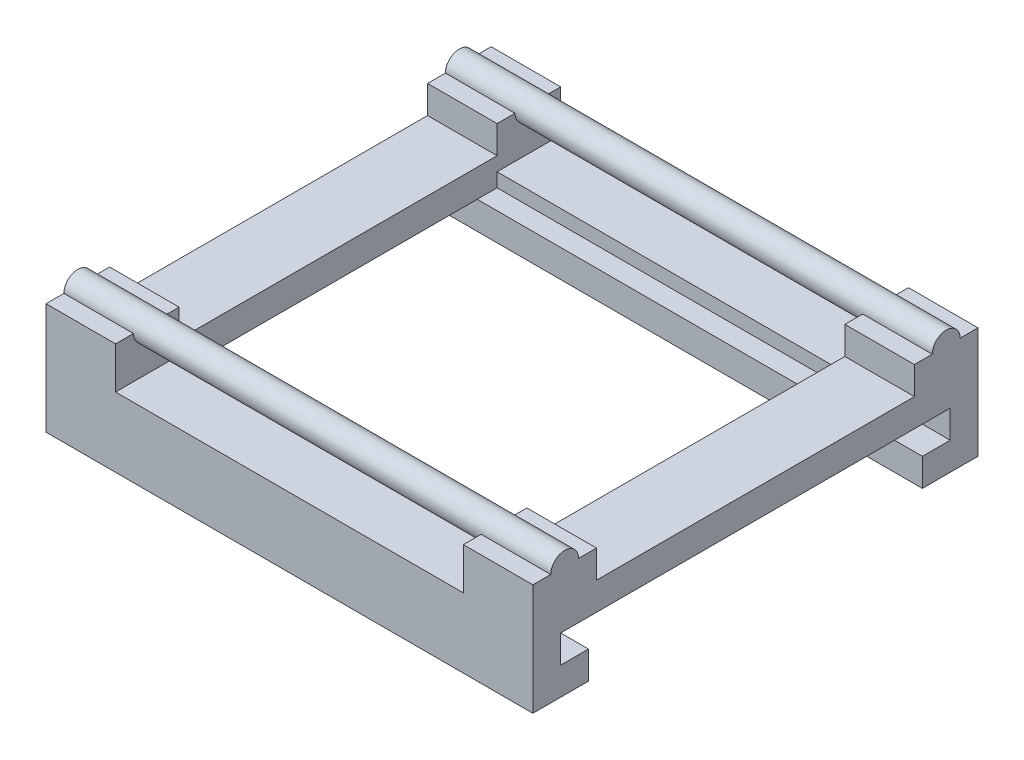
ISO-10303-21;
HEADER;
FILE_DESCRIPTION(('STEP AP214'),'2;1');
FILE_NAME('part.step','',(''),(''),'','','');
FILE_SCHEMA(('AUTOMOTIVE_DESIGN { 1 0 10303 214 1 1 1 1 }'));
ENDSEC;
DATA;
#1=APPLICATION_CONTEXT('core data for automotive mechanical design processes');
#2=APPLICATION_PROTOCOL_DEFINITION('international standard','automotive_design',2000,#1);
#3=PRODUCT_CONTEXT('',#1,'mechanical');
#4=PRODUCT('Part','Part','',(#3));
#5=PRODUCT_RELATED_PRODUCT_CATEGORY('part','',(#4));
#6=PRODUCT_DEFINITION_FORMATION('','',#4);
#7=PRODUCT_DEFINITION_CONTEXT('part definition',#1,'design');
#8=PRODUCT_DEFINITION('design','',#6,#7);
#9=PRODUCT_DEFINITION_SHAPE('','',#8);
#10=(LENGTH_UNIT() NAMED_UNIT(*) SI_UNIT(.MILLI.,.METRE.));
#11=(NAMED_UNIT(*) PLANE_ANGLE_UNIT() SI_UNIT($,.RADIAN.));
#12=(NAMED_UNIT(*) SI_UNIT($,.STERADIAN.) SOLID_ANGLE_UNIT());
#13=UNCERTAINTY_MEASURE_WITH_UNIT(LENGTH_MEASURE(1.E-05),#10,'distance_accuracy_value','');
#14=(GEOMETRIC_REPRESENTATION_CONTEXT(3) GLOBAL_UNCERTAINTY_ASSIGNED_CONTEXT((#13)) GLOBAL_UNIT_ASSIGNED_CONTEXT((#10,
#11,#12)) REPRESENTATION_CONTEXT('',''));
#15=CARTESIAN_POINT('',(0.,0.,0.));
#16=DIRECTION('',(0.,0.,1.));
#17=DIRECTION('',(1.,0.,0.));
#18=AXIS2_PLACEMENT_3D('',#15,#16,#17);
#19=CARTESIAN_POINT('',(0.,4.,0.));
#20=DIRECTION('',(0.,-1.,0.));
#21=DIRECTION('',(0.,0.,-1.));
#22=AXIS2_PLACEMENT_3D('',#19,#20,#21);
#23=PLANE('',#22);
#24=DIRECTION('',(0.,0.,-1.));
#25=VECTOR('',#24,1.);
#26=CARTESIAN_POINT('',(9.83009708737865,4.,11.6334951456311));
#27=LINE('',#26,#25);
#28=CARTESIAN_POINT('',(9.83009708737865,4.,11.6334951456311));
#29=VERTEX_POINT('',#28);
#30=CARTESIAN_POINT('',(9.83009708737865,4.,10.3477808599168));
#31=VERTEX_POINT('',#30);
#32=EDGE_CURVE('E350',#29,#31,#27,.T.);
#33=ORIENTED_EDGE('',*,*,#32,.T.);
#34=DIRECTION('',(-1.,0.,0.));
#35=VECTOR('',#34,1.);
#36=CARTESIAN_POINT('',(7.83009708737865,4.,10.3477808599168));
#37=LINE('',#36,#35);
#38=CARTESIAN_POINT('',(4.83009708737865,4.,10.3477808599168));
#39=VERTEX_POINT('',#38);
#40=EDGE_CURVE('E12',#39,#31,#37,.F.);
#41=ORIENTED_EDGE('',*,*,#40,.F.);
#42=DIRECTION('',(0.,0.,-1.));
#43=VECTOR('',#42,1.);
#44=CARTESIAN_POINT('',(4.83009708737865,4.,11.6334951456311));
#45=LINE('',#44,#43);
#46=CARTESIAN_POINT('',(4.83009708737865,4.,11.6334951456311));
#47=VERTEX_POINT('',#46);
#48=EDGE_CURVE('E356',#47,#39,#45,.T.);
#49=ORIENTED_EDGE('',*,*,#48,.F.);
#50=DIRECTION('',(-1.,0.,0.));
#51=VECTOR('',#50,1.);
#52=CARTESIAN_POINT('',(9.83009708737865,4.,11.6334951456311));
#53=LINE('',#52,#51);
#54=EDGE_CURVE('E352',#29,#47,#53,.T.);
#55=ORIENTED_EDGE('',*,*,#54,.F.);
#56=EDGE_LOOP('',(#33,#41,#49,#55));
#57=FACE_BOUND('',#56,.T.);
#58=ADVANCED_FACE('F63',(#57),#23,.F.);
#59=DIRECTION('',(-1.,0.,0.));
#60=VECTOR('',#59,1.);
#61=CARTESIAN_POINT('',(7.83009708737865,4.,8.34778085991679));
#62=LINE('',#61,#60);
#63=CARTESIAN_POINT('',(9.83009708737865,4.,8.34778085991679));
#64=VERTEX_POINT('',#63);
#65=CARTESIAN_POINT('',(4.83009708737865,4.,8.34778085991679));
#66=VERTEX_POINT('',#65);
#67=EDGE_CURVE('E71',#64,#66,#62,.T.);
#68=ORIENTED_EDGE('',*,*,#67,.F.);
#69=CARTESIAN_POINT('',(9.83009708737865,4.,7.0620665742025));
#70=VERTEX_POINT('',#69);
#71=EDGE_CURVE('E344',#64,#70,#27,.T.);
#72=ORIENTED_EDGE('',*,*,#71,.T.);
#73=DIRECTION('',(-1.,0.,0.));
#74=VECTOR('',#73,1.);
#75=CARTESIAN_POINT('',(9.83009708737865,4.,7.0620665742025));
#76=LINE('',#75,#74);
#77=CARTESIAN_POINT('',(4.83009708737865,4.,7.0620665742025));
#78=VERTEX_POINT('',#77);
#79=EDGE_CURVE('E349',#70,#78,#76,.T.);
#80=ORIENTED_EDGE('',*,*,#79,.T.);
#81=EDGE_CURVE('E355',#66,#78,#45,.T.);
#82=ORIENTED_EDGE('',*,*,#81,.F.);
#83=EDGE_LOOP('',(#68,#72,#80,#82));
#84=FACE_BOUND('',#83,.T.);
#85=ADVANCED_FACE('F508',(#84),#23,.F.);
#86=CARTESIAN_POINT('',(0.,4.,0.));
#87=DIRECTION('',(0.,1.,0.));
#88=DIRECTION('',(0.,0.,1.));
#89=AXIS2_PLACEMENT_3D('',#86,#87,#88);
#90=PLANE('',#89);
#91=DIRECTION('',(0.,0.,-1.));
#92=VECTOR('',#91,1.);
#93=CARTESIAN_POINT('',(-25.1699029126214,4.,11.6334951456311));
#94=LINE('',#93,#92);
#95=CARTESIAN_POINT('',(-25.1699029126214,4.,8.34778085991679));
#96=VERTEX_POINT('',#95);
#97=CARTESIAN_POINT('',(-25.1699029126214,4.,7.0620665742025));
#98=VERTEX_POINT('',#97);
#99=EDGE_CURVE('E310',#96,#98,#94,.T.);
#100=ORIENTED_EDGE('',*,*,#99,.F.);
#101=DIRECTION('',(-1.,0.,0.));
#102=VECTOR('',#101,1.);
#103=CARTESIAN_POINT('',(9.83009708737865,4.,8.34778085991679));
#104=LINE('',#103,#102);
#105=CARTESIAN_POINT('',(-20.1699029126214,4.,8.34778085991679));
#106=VERTEX_POINT('',#105);
#107=EDGE_CURVE('E293',#96,#106,#104,.F.);
#108=ORIENTED_EDGE('',*,*,#107,.T.);
#109=DIRECTION('',(0.,0.,-1.));
#110=VECTOR('',#109,1.);
#111=CARTESIAN_POINT('',(-20.1699029126214,4.,11.6334951456311));
#112=LINE('',#111,#110);
#113=CARTESIAN_POINT('',(-20.1699029126214,4.,7.0620665742025));
#114=VERTEX_POINT('',#113);
#115=EDGE_CURVE('E331',#106,#114,#112,.T.);
#116=ORIENTED_EDGE('',*,*,#115,.T.);
#117=DIRECTION('',(1.,0.,0.));
#118=VECTOR('',#117,1.);
#119=CARTESIAN_POINT('',(-25.1699029126214,4.,7.0620665742025));
#120=LINE('',#119,#118);
#121=EDGE_CURVE('E319',#98,#114,#120,.T.);
#122=ORIENTED_EDGE('',*,*,#121,.F.);
#123=EDGE_LOOP('',(#100,#108,#116,#122));
#124=FACE_BOUND('',#123,.T.);
#125=ADVANCED_FACE('F317',(#124),#90,.T.);
#126=CARTESIAN_POINT('',(-20.1699029126214,4.,11.6334951456311));
#127=VERTEX_POINT('',#126);
#128=CARTESIAN_POINT('',(-20.1699029126214,4.,10.3477808599168));
#129=VERTEX_POINT('',#128);
#130=EDGE_CURVE('E332',#127,#129,#112,.T.);
#131=ORIENTED_EDGE('',*,*,#130,.T.);
#132=DIRECTION('',(-1.,0.,0.));
#133=VECTOR('',#132,1.);
#134=CARTESIAN_POINT('',(9.83009708737865,4.,10.3477808599168));
#135=LINE('',#134,#133);
#136=CARTESIAN_POINT('',(-25.1699029126214,4.,10.3477808599168));
#137=VERTEX_POINT('',#136);
#138=EDGE_CURVE('E304',#129,#137,#135,.T.);
#139=ORIENTED_EDGE('',*,*,#138,.T.);
#140=CARTESIAN_POINT('',(-25.1699029126214,4.,11.6334951456311));
#141=VERTEX_POINT('',#140);
#142=EDGE_CURVE('E313',#141,#137,#94,.T.);
#143=ORIENTED_EDGE('',*,*,#142,.F.);
#144=DIRECTION('',(1.,0.,0.));
#145=VECTOR('',#144,1.);
#146=CARTESIAN_POINT('',(-25.1699029126214,4.,11.6334951456311));
#147=LINE('',#146,#145);
#148=EDGE_CURVE('E322',#141,#127,#147,.T.);
#149=ORIENTED_EDGE('',*,*,#148,.T.);
#150=EDGE_LOOP('',(#131,#139,#143,#149));
#151=FACE_BOUND('',#150,.T.);
#152=ADVANCED_FACE('F716',(#151),#90,.T.);
#153=CARTESIAN_POINT('',(0.,4.,0.));
#154=DIRECTION('',(0.,1.,0.));
#155=DIRECTION('',(0.,0.,1.));
#156=AXIS2_PLACEMENT_3D('',#153,#154,#155);
#157=PLANE('',#156);
#158=DIRECTION('',(-1.,0.,0.));
#159=VECTOR('',#158,1.);
#160=CARTESIAN_POINT('',(7.83009708737865,4.,-19.0807905686546));
#161=LINE('',#160,#159);
#162=CARTESIAN_POINT('',(4.83009708737864,4.,-19.0807905686546));
#163=VERTEX_POINT('',#162);
#164=CARTESIAN_POINT('',(9.83009708737865,4.,-19.0807905686546));
#165=VERTEX_POINT('',#164);
#166=EDGE_CURVE('E499',#163,#165,#161,.F.);
#167=ORIENTED_EDGE('',*,*,#166,.T.);
#168=DIRECTION('',(0.,0.,-1.));
#169=VECTOR('',#168,1.);
#170=CARTESIAN_POINT('',(9.83009708737865,4.,0.));
#171=LINE('',#170,#169);
#172=CARTESIAN_POINT('',(9.83009708737865,4.,-20.3665048543689));
#173=VERTEX_POINT('',#172);
#174=EDGE_CURVE('E371',#165,#173,#171,.T.);
#175=ORIENTED_EDGE('',*,*,#174,.T.);
#176=DIRECTION('',(-1.,0.,0.));
#177=VECTOR('',#176,1.);
#178=CARTESIAN_POINT('',(0.,4.,-20.3665048543689));
#179=LINE('',#178,#177);
#180=CARTESIAN_POINT('',(4.83009708737864,4.,-20.3665048543689));
#181=VERTEX_POINT('',#180);
#182=EDGE_CURVE('E361',#173,#181,#179,.T.);
#183=ORIENTED_EDGE('',*,*,#182,.T.);
#184=DIRECTION('',(0.,0.,1.));
#185=VECTOR('',#184,1.);
#186=CARTESIAN_POINT('',(4.83009708737864,4.,0.));
#187=LINE('',#186,#185);
#188=EDGE_CURVE('E365',#181,#163,#187,.T.);
#189=ORIENTED_EDGE('',*,*,#188,.T.);
#190=EDGE_LOOP('',(#167,#175,#183,#189));
#191=FACE_BOUND('',#190,.T.);
#192=ADVANCED_FACE('F626',(#191),#157,.T.);
#193=CARTESIAN_POINT('',(9.83009708737865,4.,-15.7950762829404));
#194=VERTEX_POINT('',#193);
#195=CARTESIAN_POINT('',(9.83009708737865,4.,-17.0807905686546));
#196=VERTEX_POINT('',#195);
#197=EDGE_CURVE('E372',#194,#196,#171,.T.);
#198=ORIENTED_EDGE('',*,*,#197,.T.);
#199=DIRECTION('',(-1.,0.,0.));
#200=VECTOR('',#199,1.);
#201=CARTESIAN_POINT('',(7.83009708737865,4.,-17.0807905686546));
#202=LINE('',#201,#200);
#203=CARTESIAN_POINT('',(4.83009708737864,4.,-17.0807905686546));
#204=VERTEX_POINT('',#203);
#205=EDGE_CURVE('E490',#196,#204,#202,.T.);
#206=ORIENTED_EDGE('',*,*,#205,.T.);
#207=CARTESIAN_POINT('',(4.83009708737864,4.,-15.7950762829404));
#208=VERTEX_POINT('',#207);
#209=EDGE_CURVE('E364',#204,#208,#187,.T.);
#210=ORIENTED_EDGE('',*,*,#209,.T.);
#211=DIRECTION('',(-1.,0.,0.));
#212=VECTOR('',#211,1.);
#213=CARTESIAN_POINT('',(0.,4.,-15.7950762829404));
#214=LINE('',#213,#212);
#215=EDGE_CURVE('E368',#194,#208,#214,.T.);
#216=ORIENTED_EDGE('',*,*,#215,.F.);
#217=EDGE_LOOP('',(#198,#206,#210,#216));
#218=FACE_BOUND('',#217,.T.);
#219=ADVANCED_FACE('F524',(#218),#157,.T.);
#220=CARTESIAN_POINT('',(0.,4.,0.));
#221=DIRECTION('',(0.,-1.,0.));
#222=DIRECTION('',(0.,0.,-1.));
#223=AXIS2_PLACEMENT_3D('',#220,#221,#222);
#224=PLANE('',#223);
#225=DIRECTION('',(-1.,0.,0.));
#226=VECTOR('',#225,1.);
#227=CARTESIAN_POINT('',(9.83009708737865,4.,-17.0807905686546));
#228=LINE('',#227,#226);
#229=CARTESIAN_POINT('',(-25.1699029126214,4.,-17.0807905686546));
#230=VERTEX_POINT('',#229);
#231=CARTESIAN_POINT('',(-20.1699029126214,4.,-17.0807905686546));
#232=VERTEX_POINT('',#231);
#233=EDGE_CURVE('E607',#230,#232,#228,.F.);
#234=ORIENTED_EDGE('',*,*,#233,.F.);
#235=DIRECTION('',(0.,0.,1.));
#236=VECTOR('',#235,1.);
#237=CARTESIAN_POINT('',(-25.1699029126214,4.,-20.3665048543689));
#238=LINE('',#237,#236);
#239=CARTESIAN_POINT('',(-25.1699029126214,4.,-15.7950762829404));
#240=VERTEX_POINT('',#239);
#241=EDGE_CURVE('E565',#230,#240,#238,.T.);
#242=ORIENTED_EDGE('',*,*,#241,.T.);
#243=DIRECTION('',(1.,0.,0.));
#244=VECTOR('',#243,1.);
#245=CARTESIAN_POINT('',(-25.1699029126214,4.,-15.7950762829404));
#246=LINE('',#245,#244);
#247=CARTESIAN_POINT('',(-20.1699029126214,4.,-15.7950762829404));
#248=VERTEX_POINT('',#247);
#249=EDGE_CURVE('E570',#240,#248,#246,.T.);
#250=ORIENTED_EDGE('',*,*,#249,.T.);
#251=DIRECTION('',(0.,0.,1.));
#252=VECTOR('',#251,1.);
#253=CARTESIAN_POINT('',(-20.1699029126214,4.,-20.3665048543689));
#254=LINE('',#253,#252);
#255=EDGE_CURVE('E577',#232,#248,#254,.T.);
#256=ORIENTED_EDGE('',*,*,#255,.F.);
#257=EDGE_LOOP('',(#234,#242,#250,#256));
#258=FACE_BOUND('',#257,.T.);
#259=ADVANCED_FACE('F606',(#258),#224,.F.);
#260=DIRECTION('',(-1.,0.,0.));
#261=VECTOR('',#260,1.);
#262=CARTESIAN_POINT('',(9.83009708737865,4.,-19.0807905686546));
#263=LINE('',#262,#261);
#264=CARTESIAN_POINT('',(-20.1699029126214,4.,-19.0807905686546));
#265=VERTEX_POINT('',#264);
#266=CARTESIAN_POINT('',(-25.1699029126214,4.,-19.0807905686546));
#267=VERTEX_POINT('',#266);
#268=EDGE_CURVE('E608',#265,#267,#263,.T.);
#269=ORIENTED_EDGE('',*,*,#268,.F.);
#270=CARTESIAN_POINT('',(-20.1699029126214,4.,-20.3665048543689));
#271=VERTEX_POINT('',#270);
#272=EDGE_CURVE('E578',#271,#265,#254,.T.);
#273=ORIENTED_EDGE('',*,*,#272,.F.);
#274=DIRECTION('',(1.,0.,0.));
#275=VECTOR('',#274,1.);
#276=CARTESIAN_POINT('',(-25.1699029126214,4.,-20.3665048543689));
#277=LINE('',#276,#275);
#278=CARTESIAN_POINT('',(-25.1699029126214,4.,-20.3665048543689));
#279=VERTEX_POINT('',#278);
#280=EDGE_CURVE('E574',#279,#271,#277,.T.);
#281=ORIENTED_EDGE('',*,*,#280,.F.);
#282=EDGE_CURVE('E571',#279,#267,#238,.T.);
#283=ORIENTED_EDGE('',*,*,#282,.T.);
#284=EDGE_LOOP('',(#269,#273,#281,#283));
#285=FACE_BOUND('',#284,.T.);
#286=ADVANCED_FACE('F697',(#285),#224,.F.);
#287=CARTESIAN_POINT('',(0.,2.,-15.7950762829404));
#288=DIRECTION('',(0.,0.,-1.));
#289=DIRECTION('',(-1.,0.,0.));
#290=AXIS2_PLACEMENT_3D('',#287,#288,#289);
#291=PLANE('',#290);
#292=DIRECTION('',(1.,0.,0.));
#293=VECTOR('',#292,1.);
#294=CARTESIAN_POINT('',(4.83009708737864,1.,-15.7950762829404));
#295=LINE('',#294,#293);
#296=CARTESIAN_POINT('',(-20.1699029126213,1.,-15.7950762829404));
#297=VERTEX_POINT('',#296);
#298=CARTESIAN_POINT('',(4.83009708737864,1.,-15.7950762829404));
#299=VERTEX_POINT('',#298);
#300=EDGE_CURVE('E545',#297,#299,#295,.T.);
#301=ORIENTED_EDGE('',*,*,#300,.F.);
#302=DIRECTION('',(0.,-1.,0.));
#303=VECTOR('',#302,1.);
#304=CARTESIAN_POINT('',(-20.1699029126213,2.,-15.7950762829404));
#305=LINE('',#304,#303);
#306=CARTESIAN_POINT('',(-20.1699029126213,0.,-15.7950762829404));
#307=VERTEX_POINT('',#306);
#308=EDGE_CURVE('E474',#297,#307,#305,.T.);
#309=ORIENTED_EDGE('',*,*,#308,.T.);
#310=DIRECTION('',(1.,0.,0.));
#311=VECTOR('',#310,1.);
#312=CARTESIAN_POINT('',(0.,0.,-15.7950762829404));
#313=LINE('',#312,#311);
#314=CARTESIAN_POINT('',(4.83009708737864,0.,-15.7950762829404));
#315=VERTEX_POINT('',#314);
#316=EDGE_CURVE('E468',#307,#315,#313,.T.);
#317=ORIENTED_EDGE('',*,*,#316,.T.);
#318=DIRECTION('',(0.,-1.,0.));
#319=VECTOR('',#318,1.);
#320=CARTESIAN_POINT('',(4.83009708737864,2.,-15.7950762829404));
#321=LINE('',#320,#319);
#322=EDGE_CURVE('E476',#299,#315,#321,.T.);
#323=ORIENTED_EDGE('',*,*,#322,.F.);
#324=EDGE_LOOP('',(#301,#309,#317,#323));
#325=FACE_BOUND('',#324,.T.);
#326=ADVANCED_FACE('F640',(#325),#291,.F.);
#327=CARTESIAN_POINT('',(0.,2.,0.));
#328=DIRECTION('',(0.,1.,0.));
#329=DIRECTION('',(0.,0.,1.));
#330=AXIS2_PLACEMENT_3D('',#327,#328,#329);
#331=PLANE('',#330);
#332=DIRECTION('',(0.,0.,-1.));
#333=VECTOR('',#332,1.);
#334=CARTESIAN_POINT('',(-20.1699029126214,2.,0.));
#335=LINE('',#334,#333);
#336=CARTESIAN_POINT('',(-20.1699029126214,2.,7.0620665742025));
#337=VERTEX_POINT('',#336);
#338=CARTESIAN_POINT('',(-20.1699029126213,2.,-15.7950762829404));
#339=VERTEX_POINT('',#338);
#340=EDGE_CURVE('E458',#337,#339,#335,.T.);
#341=ORIENTED_EDGE('',*,*,#340,.T.);
#342=DIRECTION('',(1.,0.,0.));
#343=VECTOR('',#342,1.);
#344=CARTESIAN_POINT('',(-25.1699029126214,2.,-15.7950762829404));
#345=LINE('',#344,#343);
#346=CARTESIAN_POINT('',(-25.1699029126214,2.,-15.7950762829404));
#347=VERTEX_POINT('',#346);
#348=EDGE_CURVE('E566',#347,#339,#345,.T.);
#349=ORIENTED_EDGE('',*,*,#348,.F.);
#350=DIRECTION('',(0.,0.,1.));
#351=VECTOR('',#350,1.);
#352=CARTESIAN_POINT('',(-25.1699029126214,2.,0.));
#353=LINE('',#352,#351);
#354=CARTESIAN_POINT('',(-25.1699029126214,2.,7.0620665742025));
#355=VERTEX_POINT('',#354);
#356=EDGE_CURVE('E481',#347,#355,#353,.T.);
#357=ORIENTED_EDGE('',*,*,#356,.T.);
#358=DIRECTION('',(1.,0.,0.));
#359=VECTOR('',#358,1.);
#360=CARTESIAN_POINT('',(-25.1699029126214,2.,7.0620665742025));
#361=LINE('',#360,#359);
#362=EDGE_CURVE('E328',#355,#337,#361,.T.);
#363=ORIENTED_EDGE('',*,*,#362,.T.);
#364=EDGE_LOOP('',(#341,#349,#357,#363));
#365=FACE_BOUND('',#364,.T.);
#366=ADVANCED_FACE('F591',(#365),#331,.T.);
#367=DIRECTION('',(0.,0.,-1.));
#368=VECTOR('',#367,1.);
#369=CARTESIAN_POINT('',(4.83009708737865,2.,0.));
#370=LINE('',#369,#368);
#371=CARTESIAN_POINT('',(4.83009708737865,2.,7.0620665742025));
#372=VERTEX_POINT('',#371);
#373=CARTESIAN_POINT('',(4.83009708737864,2.,-15.7950762829404));
#374=VERTEX_POINT('',#373);
#375=EDGE_CURVE('E456',#372,#374,#370,.T.);
#376=ORIENTED_EDGE('',*,*,#375,.F.);
#377=DIRECTION('',(-1.,0.,0.));
#378=VECTOR('',#377,1.);
#379=CARTESIAN_POINT('',(9.83009708737865,2.,7.0620665742025));
#380=LINE('',#379,#378);
#381=CARTESIAN_POINT('',(9.83009708737865,2.,7.0620665742025));
#382=VERTEX_POINT('',#381);
#383=EDGE_CURVE('E345',#382,#372,#380,.T.);
#384=ORIENTED_EDGE('',*,*,#383,.F.);
#385=DIRECTION('',(0.,0.,1.));
#386=VECTOR('',#385,1.);
#387=CARTESIAN_POINT('',(9.83009708737865,2.,-20.3665048543689));
#388=LINE('',#387,#386);
#389=CARTESIAN_POINT('',(9.83009708737865,2.,-15.7950762829404));
#390=VERTEX_POINT('',#389);
#391=EDGE_CURVE('E491',#390,#382,#388,.T.);
#392=ORIENTED_EDGE('',*,*,#391,.F.);
#393=DIRECTION('',(-1.,0.,0.));
#394=VECTOR('',#393,1.);
#395=CARTESIAN_POINT('',(0.,2.,-15.7950762829404));
#396=LINE('',#395,#394);
#397=EDGE_CURVE('E348',#390,#374,#396,.T.);
#398=ORIENTED_EDGE('',*,*,#397,.T.);
#399=EDGE_LOOP('',(#376,#384,#392,#398));
#400=FACE_BOUND('',#399,.T.);
#401=ADVANCED_FACE('F518',(#400),#331,.T.);
#402=CARTESIAN_POINT('',(0.,0.,0.));
#403=DIRECTION('',(0.,1.,0.));
#404=DIRECTION('',(0.,0.,1.));
#405=AXIS2_PLACEMENT_3D('',#402,#403,#404);
#406=PLANE('',#405);
#407=DIRECTION('',(1.,0.,0.));
#408=VECTOR('',#407,1.);
#409=CARTESIAN_POINT('',(0.,0.,7.0620665742025));
#410=LINE('',#409,#408);
#411=CARTESIAN_POINT('',(-20.1699029126214,0.,7.0620665742025));
#412=VERTEX_POINT('',#411);
#413=CARTESIAN_POINT('',(4.83009708737865,0.,7.0620665742025));
#414=VERTEX_POINT('',#413);
#415=EDGE_CURVE('E455',#412,#414,#410,.T.);
#416=ORIENTED_EDGE('',*,*,#415,.T.);
#417=DIRECTION('',(0.,0.,-1.));
#418=VECTOR('',#417,1.);
#419=CARTESIAN_POINT('',(4.83009708737865,0.,0.));
#420=LINE('',#419,#418);
#421=EDGE_CURVE('E465',#414,#315,#420,.T.);
#422=ORIENTED_EDGE('',*,*,#421,.T.);
#423=ORIENTED_EDGE('',*,*,#316,.F.);
#424=DIRECTION('',(0.,0.,-1.));
#425=VECTOR('',#424,1.);
#426=CARTESIAN_POINT('',(-20.1699029126214,0.,0.));
#427=LINE('',#426,#425);
#428=EDGE_CURVE('E459',#412,#307,#427,.T.);
#429=ORIENTED_EDGE('',*,*,#428,.F.);
#430=EDGE_LOOP('',(#416,#422,#423,#429));
#431=FACE_BOUND('',#430,.T.);
#432=DIRECTION('',(0.,0.,1.));
#433=VECTOR('',#432,1.);
#434=CARTESIAN_POINT('',(9.83009708737865,0.,-20.3665048543689));
#435=LINE('',#434,#433);
#436=CARTESIAN_POINT('',(9.83009708737865,0.,-18.3665048543689));
#437=VERTEX_POINT('',#436);
#438=CARTESIAN_POINT('',(9.83009708737865,0.,9.63349514563107));
#439=VERTEX_POINT('',#438);
#440=EDGE_CURVE('E480',#437,#439,#435,.T.);
#441=ORIENTED_EDGE('',*,*,#440,.T.);
#442=DIRECTION('',(1.,0.,0.));
#443=VECTOR('',#442,1.);
#444=CARTESIAN_POINT('',(9.83009708737865,0.,9.63349514563107));
#445=LINE('',#444,#443);
#446=CARTESIAN_POINT('',(-25.1699029126214,0.,9.63349514563107));
#447=VERTEX_POINT('',#446);
#448=EDGE_CURVE('E413',#447,#439,#445,.T.);
#449=ORIENTED_EDGE('',*,*,#448,.F.);
#450=DIRECTION('',(0.,0.,1.));
#451=VECTOR('',#450,1.);
#452=CARTESIAN_POINT('',(-25.1699029126214,0.,0.));
#453=LINE('',#452,#451);
#454=CARTESIAN_POINT('',(-25.1699029126214,0.,-18.3665048543689));
#455=VERTEX_POINT('',#454);
#456=EDGE_CURVE('E484',#455,#447,#453,.T.);
#457=ORIENTED_EDGE('',*,*,#456,.F.);
#458=DIRECTION('',(-1.,0.,0.));
#459=VECTOR('',#458,1.);
#460=CARTESIAN_POINT('',(9.83009708737865,0.,-18.3665048543689));
#461=LINE('',#460,#459);
#462=EDGE_CURVE('E389',#437,#455,#461,.T.);
#463=ORIENTED_EDGE('',*,*,#462,.F.);
#464=EDGE_LOOP('',(#441,#449,#457,#463));
#465=FACE_BOUND('',#464,.T.);
#466=ADVANCED_FACE('F648',(#431,#465),#406,.F.);
#467=CARTESIAN_POINT('',(-25.1699029126214,2.,0.));
#468=DIRECTION('',(1.,0.,0.));
#469=DIRECTION('',(0.,0.,-1.));
#470=AXIS2_PLACEMENT_3D('',#467,#468,#469);
#471=PLANE('',#470);
#472=ORIENTED_EDGE('',*,*,#142,.T.);
#473=CARTESIAN_POINT('',(-25.1699029126214,4.,9.34778085991679));
#474=DIRECTION('',(1.,0.,0.));
#475=DIRECTION('',(0.,0.,-1.));
#476=AXIS2_PLACEMENT_3D('',#473,#474,#475);
#477=CIRCLE('',#476,1.);
#478=EDGE_CURVE('E296',#96,#137,#477,.T.);
#479=ORIENTED_EDGE('',*,*,#478,.F.);
#480=ORIENTED_EDGE('',*,*,#99,.T.);
#481=DIRECTION('',(0.,-1.,0.));
#482=VECTOR('',#481,1.);
#483=CARTESIAN_POINT('',(-25.1699029126214,4.,7.0620665742025));
#484=LINE('',#483,#482);
#485=EDGE_CURVE('E569',#98,#355,#484,.T.);
#486=ORIENTED_EDGE('',*,*,#485,.T.);
#487=ORIENTED_EDGE('',*,*,#356,.F.);
#488=DIRECTION('',(0.,-1.,0.));
#489=VECTOR('',#488,1.);
#490=CARTESIAN_POINT('',(-25.1699029126214,4.,-15.7950762829404));
#491=LINE('',#490,#489);
#492=EDGE_CURVE('E563',#240,#347,#491,.T.);
#493=ORIENTED_EDGE('',*,*,#492,.F.);
#494=ORIENTED_EDGE('',*,*,#241,.F.);
#495=CARTESIAN_POINT('',(-25.1699029126214,4.,-18.0807905686546));
#496=DIRECTION('',(1.,0.,0.));
#497=DIRECTION('',(0.,0.,-1.));
#498=AXIS2_PLACEMENT_3D('',#495,#496,#497);
#499=CIRCLE('',#498,1.);
#500=EDGE_CURVE('E303',#267,#230,#499,.T.);
#501=ORIENTED_EDGE('',*,*,#500,.F.);
#502=ORIENTED_EDGE('',*,*,#282,.F.);
#503=DIRECTION('',(0.,-1.,0.));
#504=VECTOR('',#503,1.);
#505=CARTESIAN_POINT('',(-25.1699029126214,2.,-20.3665048543689));
#506=LINE('',#505,#504);
#507=CARTESIAN_POINT('',(-25.1699029126214,-4.,-20.3665048543689));
#508=VERTEX_POINT('',#507);
#509=EDGE_CURVE('E488',#279,#508,#506,.T.);
#510=ORIENTED_EDGE('',*,*,#509,.T.);
#511=DIRECTION('',(0.,0.,-1.));
#512=VECTOR('',#511,1.);
#513=CARTESIAN_POINT('',(-25.1699029126214,-4.,-20.3665048543689));
#514=LINE('',#513,#512);
#515=CARTESIAN_POINT('',(-25.1699029126214,-4.,-16.3665048543689));
#516=VERTEX_POINT('',#515);
#517=EDGE_CURVE('E439',#516,#508,#514,.T.);
#518=ORIENTED_EDGE('',*,*,#517,.F.);
#519=DIRECTION('',(0.,1.,0.));
#520=VECTOR('',#519,1.);
#521=CARTESIAN_POINT('',(-25.1699029126214,-4.,-16.3665048543689));
#522=LINE('',#521,#520);
#523=CARTESIAN_POINT('',(-25.1699029126214,-2.,-16.3665048543689));
#524=VERTEX_POINT('',#523);
#525=EDGE_CURVE('E449',#516,#524,#522,.T.);
#526=ORIENTED_EDGE('',*,*,#525,.T.);
#527=DIRECTION('',(0.,0.,1.));
#528=VECTOR('',#527,1.);
#529=CARTESIAN_POINT('',(-25.1699029126214,-2.,-18.3665048543689));
#530=LINE('',#529,#528);
#531=CARTESIAN_POINT('',(-25.1699029126214,-2.,-18.3665048543689));
#532=VERTEX_POINT('',#531);
#533=EDGE_CURVE('E397',#532,#524,#530,.T.);
#534=ORIENTED_EDGE('',*,*,#533,.F.);
#535=DIRECTION('',(0.,-1.,0.));
#536=VECTOR('',#535,1.);
#537=CARTESIAN_POINT('',(-25.1699029126214,0.,-18.3665048543689));
#538=LINE('',#537,#536);
#539=EDGE_CURVE('E392',#455,#532,#538,.T.);
#540=ORIENTED_EDGE('',*,*,#539,.F.);
#541=ORIENTED_EDGE('',*,*,#456,.T.);
#542=DIRECTION('',(0.,1.,0.));
#543=VECTOR('',#542,1.);
#544=CARTESIAN_POINT('',(-25.1699029126214,0.,9.63349514563107));
#545=LINE('',#544,#543);
#546=CARTESIAN_POINT('',(-25.1699029126214,-2.,9.63349514563107));
#547=VERTEX_POINT('',#546);
#548=EDGE_CURVE('E410',#547,#447,#545,.T.);
#549=ORIENTED_EDGE('',*,*,#548,.F.);
#550=DIRECTION('',(0.,0.,-1.));
#551=VECTOR('',#550,1.);
#552=CARTESIAN_POINT('',(-25.1699029126214,-2.,9.63349514563107));
#553=LINE('',#552,#551);
#554=CARTESIAN_POINT('',(-25.1699029126214,-2.,7.63349514563107));
#555=VERTEX_POINT('',#554);
#556=EDGE_CURVE('E418',#547,#555,#553,.T.);
#557=ORIENTED_EDGE('',*,*,#556,.T.);
#558=DIRECTION('',(0.,1.,0.));
#559=VECTOR('',#558,1.);
#560=CARTESIAN_POINT('',(-25.1699029126214,-4.,7.63349514563107));
#561=LINE('',#560,#559);
#562=CARTESIAN_POINT('',(-25.1699029126214,-4.,7.63349514563107));
#563=VERTEX_POINT('',#562);
#564=EDGE_CURVE('E436',#563,#555,#561,.T.);
#565=ORIENTED_EDGE('',*,*,#564,.F.);
#566=DIRECTION('',(0.,0.,-1.));
#567=VECTOR('',#566,1.);
#568=CARTESIAN_POINT('',(-25.1699029126214,-4.,11.6334951456311));
#569=LINE('',#568,#567);
#570=CARTESIAN_POINT('',(-25.1699029126214,-4.,11.6334951456311));
#571=VERTEX_POINT('',#570);
#572=EDGE_CURVE('E421',#571,#563,#569,.T.);
#573=ORIENTED_EDGE('',*,*,#572,.F.);
#574=DIRECTION('',(0.,-1.,0.));
#575=VECTOR('',#574,1.);
#576=CARTESIAN_POINT('',(-25.1699029126214,2.,11.6334951456311));
#577=LINE('',#576,#575);
#578=EDGE_CURVE('E483',#141,#571,#577,.T.);
#579=ORIENTED_EDGE('',*,*,#578,.F.);
#580=EDGE_LOOP('',(#472,#479,#480,#486,#487,#493,#494,#501,#502,#510,#518,#526,#534,#540,#541,
#549,#557,#565,#573,#579));
#581=FACE_BOUND('',#580,.T.);
#582=ADVANCED_FACE('F308',(#581),#471,.F.);
#583=CARTESIAN_POINT('',(9.83009708737865,2.,-20.3665048543689));
#584=DIRECTION('',(1.,0.,0.));
#585=DIRECTION('',(0.,0.,-1.));
#586=AXIS2_PLACEMENT_3D('',#583,#584,#585);
#587=PLANE('',#586);
#588=ORIENTED_EDGE('',*,*,#71,.F.);
#589=CARTESIAN_POINT('',(9.83009708737865,4.,9.34778085991679));
#590=DIRECTION('',(1.,0.,0.));
#591=DIRECTION('',(0.,0.,-1.));
#592=AXIS2_PLACEMENT_3D('',#589,#590,#591);
#593=CIRCLE('',#592,1.);
#594=EDGE_CURVE('E314',#64,#31,#593,.T.);
#595=ORIENTED_EDGE('',*,*,#594,.T.);
#596=ORIENTED_EDGE('',*,*,#32,.F.);
#597=DIRECTION('',(0.,-1.,0.));
#598=VECTOR('',#597,1.);
#599=CARTESIAN_POINT('',(9.83009708737865,2.,11.6334951456311));
#600=LINE('',#599,#598);
#601=CARTESIAN_POINT('',(9.83009708737865,-4.,11.6334951456311));
#602=VERTEX_POINT('',#601);
#603=EDGE_CURVE('E486',#29,#602,#600,.T.);
#604=ORIENTED_EDGE('',*,*,#603,.T.);
#605=DIRECTION('',(0.,0.,1.));
#606=VECTOR('',#605,1.);
#607=CARTESIAN_POINT('',(9.83009708737865,-4.,11.6334951456311));
#608=LINE('',#607,#606);
#609=CARTESIAN_POINT('',(9.83009708737865,-4.,7.63349514563107));
#610=VERTEX_POINT('',#609);
#611=EDGE_CURVE('E427',#610,#602,#608,.T.);
#612=ORIENTED_EDGE('',*,*,#611,.F.);
#613=DIRECTION('',(0.,1.,0.));
#614=VECTOR('',#613,1.);
#615=CARTESIAN_POINT('',(9.83009708737865,-4.,7.63349514563107));
#616=LINE('',#615,#614);
#617=CARTESIAN_POINT('',(9.83009708737865,-2.,7.63349514563107));
#618=VERTEX_POINT('',#617);
#619=EDGE_CURVE('E433',#610,#618,#616,.T.);
#620=ORIENTED_EDGE('',*,*,#619,.T.);
#621=DIRECTION('',(0.,0.,-1.));
#622=VECTOR('',#621,1.);
#623=CARTESIAN_POINT('',(9.83009708737865,-2.,9.63349514563107));
#624=LINE('',#623,#622);
#625=CARTESIAN_POINT('',(9.83009708737865,-2.,9.63349514563107));
#626=VERTEX_POINT('',#625);
#627=EDGE_CURVE('E416',#626,#618,#624,.T.);
#628=ORIENTED_EDGE('',*,*,#627,.F.);
#629=DIRECTION('',(0.,-1.,0.));
#630=VECTOR('',#629,1.);
#631=CARTESIAN_POINT('',(9.83009708737865,0.,9.63349514563107));
#632=LINE('',#631,#630);
#633=EDGE_CURVE('E404',#439,#626,#632,.T.);
#634=ORIENTED_EDGE('',*,*,#633,.F.);
#635=ORIENTED_EDGE('',*,*,#440,.F.);
#636=DIRECTION('',(0.,1.,0.));
#637=VECTOR('',#636,1.);
#638=CARTESIAN_POINT('',(9.83009708737865,0.,-18.3665048543689));
#639=LINE('',#638,#637);
#640=CARTESIAN_POINT('',(9.83009708737865,-2.,-18.3665048543689));
#641=VERTEX_POINT('',#640);
#642=EDGE_CURVE('E386',#641,#437,#639,.T.);
#643=ORIENTED_EDGE('',*,*,#642,.F.);
#644=DIRECTION('',(0.,0.,1.));
#645=VECTOR('',#644,1.);
#646=CARTESIAN_POINT('',(9.83009708737865,-2.,-18.3665048543689));
#647=LINE('',#646,#645);
#648=CARTESIAN_POINT('',(9.83009708737865,-2.,-16.3665048543689));
#649=VERTEX_POINT('',#648);
#650=EDGE_CURVE('E399',#641,#649,#647,.T.);
#651=ORIENTED_EDGE('',*,*,#650,.T.);
#652=DIRECTION('',(0.,1.,0.));
#653=VECTOR('',#652,1.);
#654=CARTESIAN_POINT('',(9.83009708737865,-4.,-16.3665048543689));
#655=LINE('',#654,#653);
#656=CARTESIAN_POINT('',(9.83009708737865,-4.,-16.3665048543689));
#657=VERTEX_POINT('',#656);
#658=EDGE_CURVE('E452',#657,#649,#655,.T.);
#659=ORIENTED_EDGE('',*,*,#658,.F.);
#660=DIRECTION('',(0.,0.,1.));
#661=VECTOR('',#660,1.);
#662=CARTESIAN_POINT('',(9.83009708737865,-4.,-20.3665048543689));
#663=LINE('',#662,#661);
#664=CARTESIAN_POINT('',(9.83009708737865,-4.,-20.3665048543689));
#665=VERTEX_POINT('',#664);
#666=EDGE_CURVE('E445',#665,#657,#663,.T.);
#667=ORIENTED_EDGE('',*,*,#666,.F.);
#668=DIRECTION('',(0.,-1.,0.));
#669=VECTOR('',#668,1.);
#670=CARTESIAN_POINT('',(9.83009708737865,2.,-20.3665048543689));
#671=LINE('',#670,#669);
#672=EDGE_CURVE('E494',#173,#665,#671,.T.);
#673=ORIENTED_EDGE('',*,*,#672,.F.);
#674=ORIENTED_EDGE('',*,*,#174,.F.);
#675=CARTESIAN_POINT('',(9.83009708737865,4.,-18.0807905686546));
#676=DIRECTION('',(1.,0.,0.));
#677=DIRECTION('',(0.,0.,-1.));
#678=AXIS2_PLACEMENT_3D('',#675,#676,#677);
#679=CIRCLE('',#678,1.);
#680=EDGE_CURVE('E611',#165,#196,#679,.T.);
#681=ORIENTED_EDGE('',*,*,#680,.T.);
#682=ORIENTED_EDGE('',*,*,#197,.F.);
#683=DIRECTION('',(0.,-1.,0.));
#684=VECTOR('',#683,1.);
#685=CARTESIAN_POINT('',(9.83009708737865,4.,-15.7950762829404));
#686=LINE('',#685,#684);
#687=EDGE_CURVE('E375',#194,#390,#686,.T.);
#688=ORIENTED_EDGE('',*,*,#687,.T.);
#689=ORIENTED_EDGE('',*,*,#391,.T.);
#690=DIRECTION('',(0.,-1.,0.));
#691=VECTOR('',#690,1.);
#692=CARTESIAN_POINT('',(9.83009708737865,4.,7.0620665742025));
#693=LINE('',#692,#691);
#694=EDGE_CURVE('E341',#70,#382,#693,.T.);
#695=ORIENTED_EDGE('',*,*,#694,.F.);
#696=EDGE_LOOP('',(#588,#595,#596,#604,#612,#620,#628,#634,#635,#643,#651,#659,#667,#673,#674,
#681,#682,#688,#689,#695));
#697=FACE_BOUND('',#696,.T.);
#698=ADVANCED_FACE('F619',(#697),#587,.T.);
#699=CARTESIAN_POINT('',(-25.1699029126214,2.,-20.3665048543689));
#700=DIRECTION('',(0.,0.,-1.));
#701=DIRECTION('',(-1.,0.,0.));
#702=AXIS2_PLACEMENT_3D('',#699,#700,#701);
#703=PLANE('',#702);
#704=DIRECTION('',(-1.,0.,0.));
#705=VECTOR('',#704,1.);
#706=CARTESIAN_POINT('',(4.83009708737864,1.,-20.3665048543689));
#707=LINE('',#706,#705);
#708=CARTESIAN_POINT('',(4.83009708737864,1.,-20.3665048543689));
#709=VERTEX_POINT('',#708);
#710=CARTESIAN_POINT('',(-20.1699029126213,1.,-20.3665048543689));
#711=VERTEX_POINT('',#710);
#712=EDGE_CURVE('E536',#709,#711,#707,.T.);
#713=ORIENTED_EDGE('',*,*,#712,.F.);
#714=DIRECTION('',(0.,-1.,0.));
#715=VECTOR('',#714,1.);
#716=CARTESIAN_POINT('',(4.83009708737864,4.,-20.3665048543689));
#717=LINE('',#716,#715);
#718=EDGE_CURVE('E383',#181,#709,#717,.T.);
#719=ORIENTED_EDGE('',*,*,#718,.F.);
#720=ORIENTED_EDGE('',*,*,#182,.F.);
#721=ORIENTED_EDGE('',*,*,#672,.T.);
#722=DIRECTION('',(1.,0.,0.));
#723=VECTOR('',#722,1.);
#724=CARTESIAN_POINT('',(-25.1699029126214,-4.,-20.3665048543689));
#725=LINE('',#724,#723);
#726=EDGE_CURVE('E442',#508,#665,#725,.T.);
#727=ORIENTED_EDGE('',*,*,#726,.F.);
#728=ORIENTED_EDGE('',*,*,#509,.F.);
#729=ORIENTED_EDGE('',*,*,#280,.T.);
#730=DIRECTION('',(0.,-1.,0.));
#731=VECTOR('',#730,1.);
#732=CARTESIAN_POINT('',(-20.1699029126214,4.,-20.3665048543689));
#733=LINE('',#732,#731);
#734=EDGE_CURVE('E561',#271,#711,#733,.T.);
#735=ORIENTED_EDGE('',*,*,#734,.T.);
#736=EDGE_LOOP('',(#713,#719,#720,#721,#727,#728,#729,#735));
#737=FACE_BOUND('',#736,.T.);
#738=ADVANCED_FACE('F634',(#737),#703,.T.);
#739=CARTESIAN_POINT('',(-25.1699029126214,2.,11.6334951456311));
#740=DIRECTION('',(0.,0.,-1.));
#741=DIRECTION('',(-1.,0.,0.));
#742=AXIS2_PLACEMENT_3D('',#739,#740,#741);
#743=PLANE('',#742);
#744=DIRECTION('',(1.,0.,0.));
#745=VECTOR('',#744,1.);
#746=CARTESIAN_POINT('',(-20.1699029126214,1.,11.6334951456311));
#747=LINE('',#746,#745);
#748=CARTESIAN_POINT('',(-20.1699029126214,1.,11.6334951456311));
#749=VERTEX_POINT('',#748);
#750=CARTESIAN_POINT('',(4.83009708737865,1.,11.6334951456311));
#751=VERTEX_POINT('',#750);
#752=EDGE_CURVE('E544',#749,#751,#747,.T.);
#753=ORIENTED_EDGE('',*,*,#752,.F.);
#754=DIRECTION('',(0.,-1.,0.));
#755=VECTOR('',#754,1.);
#756=CARTESIAN_POINT('',(-20.1699029126214,4.,11.6334951456311));
#757=LINE('',#756,#755);
#758=EDGE_CURVE('E324',#127,#749,#757,.T.);
#759=ORIENTED_EDGE('',*,*,#758,.F.);
#760=ORIENTED_EDGE('',*,*,#148,.F.);
#761=ORIENTED_EDGE('',*,*,#578,.T.);
#762=DIRECTION('',(-1.,0.,0.));
#763=VECTOR('',#762,1.);
#764=CARTESIAN_POINT('',(-25.1699029126214,-4.,11.6334951456311));
#765=LINE('',#764,#763);
#766=EDGE_CURVE('E430',#602,#571,#765,.T.);
#767=ORIENTED_EDGE('',*,*,#766,.F.);
#768=ORIENTED_EDGE('',*,*,#603,.F.);
#769=ORIENTED_EDGE('',*,*,#54,.T.);
#770=DIRECTION('',(0.,-1.,0.));
#771=VECTOR('',#770,1.);
#772=CARTESIAN_POINT('',(4.83009708737865,4.,11.6334951456311));
#773=LINE('',#772,#771);
#774=EDGE_CURVE('E339',#47,#751,#773,.T.);
#775=ORIENTED_EDGE('',*,*,#774,.T.);
#776=EDGE_LOOP('',(#753,#759,#760,#761,#767,#768,#769,#775));
#777=FACE_BOUND('',#776,.T.);
#778=ADVANCED_FACE('F65',(#777),#743,.F.);
#779=CARTESIAN_POINT('',(0.,2.,7.0620665742025));
#780=DIRECTION('',(0.,0.,-1.));
#781=DIRECTION('',(-1.,0.,0.));
#782=AXIS2_PLACEMENT_3D('',#779,#780,#781);
#783=PLANE('',#782);
#784=DIRECTION('',(-1.,0.,0.));
#785=VECTOR('',#784,1.);
#786=CARTESIAN_POINT('',(-20.1699029126214,1.,7.0620665742025));
#787=LINE('',#786,#785);
#788=CARTESIAN_POINT('',(4.83009708737865,1.,7.0620665742025));
#789=VERTEX_POINT('',#788);
#790=CARTESIAN_POINT('',(-20.1699029126214,1.,7.0620665742025));
#791=VERTEX_POINT('',#790);
#792=EDGE_CURVE('E550',#789,#791,#787,.T.);
#793=ORIENTED_EDGE('',*,*,#792,.F.);
#794=DIRECTION('',(0.,-1.,0.));
#795=VECTOR('',#794,1.);
#796=CARTESIAN_POINT('',(4.83009708737865,2.,7.0620665742025));
#797=LINE('',#796,#795);
#798=EDGE_CURVE('E478',#789,#414,#797,.T.);
#799=ORIENTED_EDGE('',*,*,#798,.T.);
#800=ORIENTED_EDGE('',*,*,#415,.F.);
#801=DIRECTION('',(0.,-1.,0.));
#802=VECTOR('',#801,1.);
#803=CARTESIAN_POINT('',(-20.1699029126214,2.,7.0620665742025));
#804=LINE('',#803,#802);
#805=EDGE_CURVE('E462',#791,#412,#804,.T.);
#806=ORIENTED_EDGE('',*,*,#805,.F.);
#807=EDGE_LOOP('',(#793,#799,#800,#806));
#808=FACE_BOUND('',#807,.T.);
#809=ADVANCED_FACE('F653',(#808),#783,.T.);
#810=CARTESIAN_POINT('',(4.83009708737865,2.,0.));
#811=DIRECTION('',(-1.,0.,0.));
#812=DIRECTION('',(0.,0.,1.));
#813=AXIS2_PLACEMENT_3D('',#810,#811,#812);
#814=PLANE('',#813);
#815=ORIENTED_EDGE('',*,*,#48,.T.);
#816=CARTESIAN_POINT('',(4.83009708737865,4.,9.34778085991679));
#817=DIRECTION('',(-1.,0.,0.));
#818=DIRECTION('',(0.,0.,1.));
#819=AXIS2_PLACEMENT_3D('',#816,#817,#818);
#820=CIRCLE('',#819,1.);
#821=EDGE_CURVE('E501',#39,#66,#820,.F.);
#822=ORIENTED_EDGE('',*,*,#821,.T.);
#823=ORIENTED_EDGE('',*,*,#81,.T.);
#824=DIRECTION('',(0.,-1.,0.));
#825=VECTOR('',#824,1.);
#826=CARTESIAN_POINT('',(4.83009708737865,4.,7.0620665742025));
#827=LINE('',#826,#825);
#828=EDGE_CURVE('E336',#78,#372,#827,.T.);
#829=ORIENTED_EDGE('',*,*,#828,.T.);
#830=ORIENTED_EDGE('',*,*,#375,.T.);
#831=DIRECTION('',(0.,-1.,0.));
#832=VECTOR('',#831,1.);
#833=CARTESIAN_POINT('',(4.83009708737864,4.,-15.7950762829404));
#834=LINE('',#833,#832);
#835=EDGE_CURVE('E380',#208,#374,#834,.T.);
#836=ORIENTED_EDGE('',*,*,#835,.F.);
#837=ORIENTED_EDGE('',*,*,#209,.F.);
#838=CARTESIAN_POINT('',(4.83009708737865,4.,-18.0807905686546));
#839=DIRECTION('',(-1.,0.,0.));
#840=DIRECTION('',(0.,0.,1.));
#841=AXIS2_PLACEMENT_3D('',#838,#839,#840);
#842=CIRCLE('',#841,1.);
#843=EDGE_CURVE('E527',#204,#163,#842,.F.);
#844=ORIENTED_EDGE('',*,*,#843,.T.);
#845=ORIENTED_EDGE('',*,*,#188,.F.);
#846=ORIENTED_EDGE('',*,*,#718,.T.);
#847=DIRECTION('',(0.,0.,-1.));
#848=VECTOR('',#847,1.);
#849=CARTESIAN_POINT('',(4.83009708737864,1.,-15.7950762829404));
#850=LINE('',#849,#848);
#851=EDGE_CURVE('E533',#299,#709,#850,.T.);
#852=ORIENTED_EDGE('',*,*,#851,.F.);
#853=ORIENTED_EDGE('',*,*,#322,.T.);
#854=ORIENTED_EDGE('',*,*,#421,.F.);
#855=ORIENTED_EDGE('',*,*,#798,.F.);
#856=DIRECTION('',(0.,0.,-1.));
#857=VECTOR('',#856,1.);
#858=CARTESIAN_POINT('',(4.83009708737865,1.,11.6334951456311));
#859=LINE('',#858,#857);
#860=EDGE_CURVE('E548',#751,#789,#859,.T.);
#861=ORIENTED_EDGE('',*,*,#860,.F.);
#862=ORIENTED_EDGE('',*,*,#774,.F.);
#863=EDGE_LOOP('',(#815,#822,#823,#829,#830,#836,#837,#844,#845,#846,#852,#853,#854,#855,#861,#862));
#864=FACE_BOUND('',#863,.T.);
#865=ADVANCED_FACE('F504',(#864),#814,.T.);
#866=CARTESIAN_POINT('',(-20.1699029126214,2.,0.));
#867=DIRECTION('',(-1.,0.,0.));
#868=DIRECTION('',(0.,0.,1.));
#869=AXIS2_PLACEMENT_3D('',#866,#867,#868);
#870=PLANE('',#869);
#871=CARTESIAN_POINT('',(-20.1699029126214,4.,9.34778085991679));
#872=DIRECTION('',(1.,0.,0.));
#873=DIRECTION('',(0.,0.,-1.));
#874=AXIS2_PLACEMENT_3D('',#871,#872,#873);
#875=CIRCLE('',#874,1.);
#876=EDGE_CURVE('E299',#129,#106,#875,.T.);
#877=ORIENTED_EDGE('',*,*,#876,.F.);
#878=ORIENTED_EDGE('',*,*,#130,.F.);
#879=ORIENTED_EDGE('',*,*,#758,.T.);
#880=DIRECTION('',(0.,0.,1.));
#881=VECTOR('',#880,1.);
#882=CARTESIAN_POINT('',(-20.1699029126214,1.,11.6334951456311));
#883=LINE('',#882,#881);
#884=EDGE_CURVE('E541',#791,#749,#883,.T.);
#885=ORIENTED_EDGE('',*,*,#884,.F.);
#886=ORIENTED_EDGE('',*,*,#805,.T.);
#887=ORIENTED_EDGE('',*,*,#428,.T.);
#888=ORIENTED_EDGE('',*,*,#308,.F.);
#889=DIRECTION('',(0.,0.,1.));
#890=VECTOR('',#889,1.);
#891=CARTESIAN_POINT('',(-20.1699029126213,1.,-15.7950762829404));
#892=LINE('',#891,#890);
#893=EDGE_CURVE('E556',#711,#297,#892,.T.);
#894=ORIENTED_EDGE('',*,*,#893,.F.);
#895=ORIENTED_EDGE('',*,*,#734,.F.);
#896=ORIENTED_EDGE('',*,*,#272,.T.);
#897=CARTESIAN_POINT('',(-20.1699029126214,4.,-18.0807905686546));
#898=DIRECTION('',(1.,0.,0.));
#899=DIRECTION('',(0.,0.,-1.));
#900=AXIS2_PLACEMENT_3D('',#897,#898,#899);
#901=CIRCLE('',#900,1.);
#902=EDGE_CURVE('E506',#232,#265,#901,.T.);
#903=ORIENTED_EDGE('',*,*,#902,.F.);
#904=ORIENTED_EDGE('',*,*,#255,.T.);
#905=DIRECTION('',(0.,-1.,0.));
#906=VECTOR('',#905,1.);
#907=CARTESIAN_POINT('',(-20.1699029126214,4.,-15.7950762829404));
#908=LINE('',#907,#906);
#909=EDGE_CURVE('E552',#248,#339,#908,.T.);
#910=ORIENTED_EDGE('',*,*,#909,.T.);
#911=ORIENTED_EDGE('',*,*,#340,.F.);
#912=DIRECTION('',(0.,-1.,0.));
#913=VECTOR('',#912,1.);
#914=CARTESIAN_POINT('',(-20.1699029126214,4.,7.0620665742025));
#915=LINE('',#914,#913);
#916=EDGE_CURVE('E320',#114,#337,#915,.T.);
#917=ORIENTED_EDGE('',*,*,#916,.F.);
#918=ORIENTED_EDGE('',*,*,#115,.F.);
#919=EDGE_LOOP('',(#877,#878,#879,#885,#886,#887,#888,#894,#895,#896,#903,#904,#910,#911,#917,#918));
#920=FACE_BOUND('',#919,.T.);
#921=ADVANCED_FACE('F594',(#920),#870,.F.);
#922=CARTESIAN_POINT('',(-25.1699029126214,-4.,-16.3665048543689));
#923=DIRECTION('',(0.,0.,-1.));
#924=DIRECTION('',(-1.,0.,0.));
#925=AXIS2_PLACEMENT_3D('',#922,#923,#924);
#926=PLANE('',#925);
#927=ORIENTED_EDGE('',*,*,#658,.T.);
#928=DIRECTION('',(1.,0.,0.));
#929=VECTOR('',#928,1.);
#930=CARTESIAN_POINT('',(9.83009708737865,-2.,-16.3665048543689));
#931=LINE('',#930,#929);
#932=EDGE_CURVE('E385',#524,#649,#931,.T.);
#933=ORIENTED_EDGE('',*,*,#932,.F.);
#934=ORIENTED_EDGE('',*,*,#525,.F.);
#935=DIRECTION('',(-1.,0.,0.));
#936=VECTOR('',#935,1.);
#937=CARTESIAN_POINT('',(-25.1699029126214,-4.,-16.3665048543689));
#938=LINE('',#937,#936);
#939=EDGE_CURVE('E447',#657,#516,#938,.T.);
#940=ORIENTED_EDGE('',*,*,#939,.F.);
#941=EDGE_LOOP('',(#927,#933,#934,#940));
#942=FACE_BOUND('',#941,.T.);
#943=ADVANCED_FACE('F692',(#942),#926,.F.);
#944=CARTESIAN_POINT('',(0.,-4.,0.));
#945=DIRECTION('',(0.,1.,0.));
#946=DIRECTION('',(0.,0.,1.));
#947=AXIS2_PLACEMENT_3D('',#944,#945,#946);
#948=PLANE('',#947);
#949=ORIENTED_EDGE('',*,*,#517,.T.);
#950=ORIENTED_EDGE('',*,*,#726,.T.);
#951=ORIENTED_EDGE('',*,*,#666,.T.);
#952=ORIENTED_EDGE('',*,*,#939,.T.);
#953=EDGE_LOOP('',(#949,#950,#951,#952));
#954=FACE_BOUND('',#953,.T.);
#955=ADVANCED_FACE('F694',(#954),#948,.F.);
#956=CARTESIAN_POINT('',(-25.1699029126214,-4.,7.63349514563107));
#957=DIRECTION('',(0.,0.,1.));
#958=DIRECTION('',(1.,0.,0.));
#959=AXIS2_PLACEMENT_3D('',#956,#957,#958);
#960=PLANE('',#959);
#961=ORIENTED_EDGE('',*,*,#564,.T.);
#962=DIRECTION('',(-1.,0.,0.));
#963=VECTOR('',#962,1.);
#964=CARTESIAN_POINT('',(9.83009708737865,-2.,7.63349514563107));
#965=LINE('',#964,#963);
#966=EDGE_CURVE('E402',#618,#555,#965,.T.);
#967=ORIENTED_EDGE('',*,*,#966,.F.);
#968=ORIENTED_EDGE('',*,*,#619,.F.);
#969=DIRECTION('',(1.,0.,0.));
#970=VECTOR('',#969,1.);
#971=CARTESIAN_POINT('',(-25.1699029126214,-4.,7.63349514563107));
#972=LINE('',#971,#970);
#973=EDGE_CURVE('E425',#563,#610,#972,.T.);
#974=ORIENTED_EDGE('',*,*,#973,.F.);
#975=EDGE_LOOP('',(#961,#967,#968,#974));
#976=FACE_BOUND('',#975,.T.);
#977=ADVANCED_FACE('F668',(#976),#960,.F.);
#978=CARTESIAN_POINT('',(0.,-4.,0.));
#979=DIRECTION('',(0.,-1.,0.));
#980=DIRECTION('',(0.,0.,-1.));
#981=AXIS2_PLACEMENT_3D('',#978,#979,#980);
#982=PLANE('',#981);
#983=ORIENTED_EDGE('',*,*,#572,.T.);
#984=ORIENTED_EDGE('',*,*,#973,.T.);
#985=ORIENTED_EDGE('',*,*,#611,.T.);
#986=ORIENTED_EDGE('',*,*,#766,.T.);
#987=EDGE_LOOP('',(#983,#984,#985,#986));
#988=FACE_BOUND('',#987,.T.);
#989=ADVANCED_FACE('F662',(#988),#982,.T.);
#990=CARTESIAN_POINT('',(9.83009708737865,-2.,9.63349514563107));
#991=DIRECTION('',(0.,-1.,0.));
#992=DIRECTION('',(0.,0.,-1.));
#993=AXIS2_PLACEMENT_3D('',#990,#991,#992);
#994=PLANE('',#993);
#995=ORIENTED_EDGE('',*,*,#966,.T.);
#996=ORIENTED_EDGE('',*,*,#556,.F.);
#997=DIRECTION('',(-1.,0.,0.));
#998=VECTOR('',#997,1.);
#999=CARTESIAN_POINT('',(9.83009708737865,-2.,9.63349514563107));
#1000=LINE('',#999,#998);
#1001=EDGE_CURVE('E407',#626,#547,#1000,.T.);
#1002=ORIENTED_EDGE('',*,*,#1001,.F.);
#1003=ORIENTED_EDGE('',*,*,#627,.T.);
#1004=EDGE_LOOP('',(#995,#996,#1002,#1003));
#1005=FACE_BOUND('',#1004,.T.);
#1006=ADVANCED_FACE('F672',(#1005),#994,.F.);
#1007=CARTESIAN_POINT('',(0.,0.,9.63349514563107));
#1008=DIRECTION('',(0.,0.,-1.));
#1009=DIRECTION('',(-1.,0.,0.));
#1010=AXIS2_PLACEMENT_3D('',#1007,#1008,#1009);
#1011=PLANE('',#1010);
#1012=ORIENTED_EDGE('',*,*,#633,.T.);
#1013=ORIENTED_EDGE('',*,*,#1001,.T.);
#1014=ORIENTED_EDGE('',*,*,#548,.T.);
#1015=ORIENTED_EDGE('',*,*,#448,.T.);
#1016=EDGE_LOOP('',(#1012,#1013,#1014,#1015));
#1017=FACE_BOUND('',#1016,.T.);
#1018=ADVANCED_FACE('F675',(#1017),#1011,.T.);
#1019=CARTESIAN_POINT('',(9.83009708737865,-2.,-18.3665048543689));
#1020=DIRECTION('',(0.,-1.,0.));
#1021=DIRECTION('',(0.,0.,-1.));
#1022=AXIS2_PLACEMENT_3D('',#1019,#1020,#1021);
#1023=PLANE('',#1022);
#1024=ORIENTED_EDGE('',*,*,#932,.T.);
#1025=ORIENTED_EDGE('',*,*,#650,.F.);
#1026=DIRECTION('',(1.,0.,0.));
#1027=VECTOR('',#1026,1.);
#1028=CARTESIAN_POINT('',(9.83009708737865,-2.,-18.3665048543689));
#1029=LINE('',#1028,#1027);
#1030=EDGE_CURVE('E394',#532,#641,#1029,.T.);
#1031=ORIENTED_EDGE('',*,*,#1030,.F.);
#1032=ORIENTED_EDGE('',*,*,#533,.T.);
#1033=EDGE_LOOP('',(#1024,#1025,#1031,#1032));
#1034=FACE_BOUND('',#1033,.T.);
#1035=ADVANCED_FACE('F686',(#1034),#1023,.F.);
#1036=CARTESIAN_POINT('',(0.,0.,-18.3665048543689));
#1037=DIRECTION('',(0.,0.,-1.));
#1038=DIRECTION('',(-1.,0.,0.));
#1039=AXIS2_PLACEMENT_3D('',#1036,#1037,#1038);
#1040=PLANE('',#1039);
#1041=ORIENTED_EDGE('',*,*,#642,.T.);
#1042=ORIENTED_EDGE('',*,*,#462,.T.);
#1043=ORIENTED_EDGE('',*,*,#539,.T.);
#1044=ORIENTED_EDGE('',*,*,#1030,.T.);
#1045=EDGE_LOOP('',(#1041,#1042,#1043,#1044));
#1046=FACE_BOUND('',#1045,.T.);
#1047=ADVANCED_FACE('F681',(#1046),#1040,.F.);
#1048=CARTESIAN_POINT('',(0.,4.,-15.7950762829404));
#1049=DIRECTION('',(0.,0.,1.));
#1050=DIRECTION('',(1.,0.,0.));
#1051=AXIS2_PLACEMENT_3D('',#1048,#1049,#1050);
#1052=PLANE('',#1051);
#1053=ORIENTED_EDGE('',*,*,#397,.F.);
#1054=ORIENTED_EDGE('',*,*,#687,.F.);
#1055=ORIENTED_EDGE('',*,*,#215,.T.);
#1056=ORIENTED_EDGE('',*,*,#835,.T.);
#1057=EDGE_LOOP('',(#1053,#1054,#1055,#1056));
#1058=FACE_BOUND('',#1057,.T.);
#1059=ADVANCED_FACE('F520',(#1058),#1052,.T.);
#1060=CARTESIAN_POINT('',(9.83009708737865,4.,7.0620665742025));
#1061=DIRECTION('',(0.,0.,1.));
#1062=DIRECTION('',(1.,0.,0.));
#1063=AXIS2_PLACEMENT_3D('',#1060,#1061,#1062);
#1064=PLANE('',#1063);
#1065=ORIENTED_EDGE('',*,*,#383,.T.);
#1066=ORIENTED_EDGE('',*,*,#828,.F.);
#1067=ORIENTED_EDGE('',*,*,#79,.F.);
#1068=ORIENTED_EDGE('',*,*,#694,.T.);
#1069=EDGE_LOOP('',(#1065,#1066,#1067,#1068));
#1070=FACE_BOUND('',#1069,.T.);
#1071=ADVANCED_FACE('F513',(#1070),#1064,.F.);
#1072=CARTESIAN_POINT('',(-25.1699029126214,4.,7.0620665742025));
#1073=DIRECTION('',(0.,0.,-1.));
#1074=DIRECTION('',(-1.,0.,0.));
#1075=AXIS2_PLACEMENT_3D('',#1072,#1073,#1074);
#1076=PLANE('',#1075);
#1077=ORIENTED_EDGE('',*,*,#362,.F.);
#1078=ORIENTED_EDGE('',*,*,#485,.F.);
#1079=ORIENTED_EDGE('',*,*,#121,.T.);
#1080=ORIENTED_EDGE('',*,*,#916,.T.);
#1081=EDGE_LOOP('',(#1077,#1078,#1079,#1080));
#1082=FACE_BOUND('',#1081,.T.);
#1083=ADVANCED_FACE('F587',(#1082),#1076,.T.);
#1084=CARTESIAN_POINT('',(-25.1699029126214,4.,-15.7950762829404));
#1085=DIRECTION('',(0.,0.,-1.));
#1086=DIRECTION('',(-1.,0.,0.));
#1087=AXIS2_PLACEMENT_3D('',#1084,#1085,#1086);
#1088=PLANE('',#1087);
#1089=ORIENTED_EDGE('',*,*,#348,.T.);
#1090=ORIENTED_EDGE('',*,*,#909,.F.);
#1091=ORIENTED_EDGE('',*,*,#249,.F.);
#1092=ORIENTED_EDGE('',*,*,#492,.T.);
#1093=EDGE_LOOP('',(#1089,#1090,#1091,#1092));
#1094=FACE_BOUND('',#1093,.T.);
#1095=ADVANCED_FACE('F600',(#1094),#1088,.F.);
#1096=CARTESIAN_POINT('',(0.,1.,0.));
#1097=DIRECTION('',(0.,1.,0.));
#1098=DIRECTION('',(0.,0.,1.));
#1099=AXIS2_PLACEMENT_3D('',#1096,#1097,#1098);
#1100=PLANE('',#1099);
#1101=ORIENTED_EDGE('',*,*,#851,.T.);
#1102=ORIENTED_EDGE('',*,*,#712,.T.);
#1103=ORIENTED_EDGE('',*,*,#893,.T.);
#1104=ORIENTED_EDGE('',*,*,#300,.T.);
#1105=EDGE_LOOP('',(#1101,#1102,#1103,#1104));
#1106=FACE_BOUND('',#1105,.T.);
#1107=ADVANCED_FACE('F631',(#1106),#1100,.T.);
#1108=CARTESIAN_POINT('',(0.,1.,0.));
#1109=DIRECTION('',(0.,-1.,0.));
#1110=DIRECTION('',(0.,0.,-1.));
#1111=AXIS2_PLACEMENT_3D('',#1108,#1109,#1110);
#1112=PLANE('',#1111);
#1113=ORIENTED_EDGE('',*,*,#884,.T.);
#1114=ORIENTED_EDGE('',*,*,#752,.T.);
#1115=ORIENTED_EDGE('',*,*,#860,.T.);
#1116=ORIENTED_EDGE('',*,*,#792,.T.);
#1117=EDGE_LOOP('',(#1113,#1114,#1115,#1116));
#1118=FACE_BOUND('',#1117,.T.);
#1119=ADVANCED_FACE('F655',(#1118),#1112,.F.);
#1120=CARTESIAN_POINT('',(7.83009708737865,4.,-18.0807905686546));
#1121=DIRECTION('',(-1.,0.,0.));
#1122=DIRECTION('',(0.,0.,1.));
#1123=AXIS2_PLACEMENT_3D('',#1120,#1121,#1122);
#1124=CYLINDRICAL_SURFACE('',#1123,1.);
#1125=ORIENTED_EDGE('',*,*,#166,.F.);
#1126=ORIENTED_EDGE('',*,*,#843,.F.);
#1127=ORIENTED_EDGE('',*,*,#205,.F.);
#1128=ORIENTED_EDGE('',*,*,#680,.F.);
#1129=EDGE_LOOP('',(#1125,#1126,#1127,#1128));
#1130=FACE_BOUND('',#1129,.T.);
#1131=ORIENTED_EDGE('',*,*,#902,.T.);
#1132=ORIENTED_EDGE('',*,*,#268,.T.);
#1133=ORIENTED_EDGE('',*,*,#500,.T.);
#1134=ORIENTED_EDGE('',*,*,#233,.T.);
#1135=EDGE_LOOP('',(#1131,#1132,#1133,#1134));
#1136=FACE_BOUND('',#1135,.T.);
#1137=ADVANCED_FACE('F530',(#1130,#1136),#1124,.T.);
#1138=CARTESIAN_POINT('',(7.83009708737865,4.,9.34778085991679));
#1139=DIRECTION('',(-1.,0.,0.));
#1140=DIRECTION('',(0.,0.,1.));
#1141=AXIS2_PLACEMENT_3D('',#1138,#1139,#1140);
#1142=CYLINDRICAL_SURFACE('',#1141,1.);
#1143=ORIENTED_EDGE('',*,*,#876,.T.);
#1144=ORIENTED_EDGE('',*,*,#107,.F.);
#1145=ORIENTED_EDGE('',*,*,#478,.T.);
#1146=ORIENTED_EDGE('',*,*,#138,.F.);
#1147=EDGE_LOOP('',(#1143,#1144,#1145,#1146));
#1148=FACE_BOUND('',#1147,.T.);
#1149=ORIENTED_EDGE('',*,*,#821,.F.);
#1150=ORIENTED_EDGE('',*,*,#40,.T.);
#1151=ORIENTED_EDGE('',*,*,#594,.F.);
#1152=ORIENTED_EDGE('',*,*,#67,.T.);
#1153=EDGE_LOOP('',(#1149,#1150,#1151,#1152));
#1154=FACE_BOUND('',#1153,.T.);
#1155=ADVANCED_FACE('F295',(#1148,#1154),#1142,.T.);
#1156=CLOSED_SHELL('',(#58,#85,#125,#152,#192,#219,#259,#286,#326,#366,#401,#466,#582,#698,#738,
#778,#809,#865,#921,#943,#955,#977,#989,#1006,#1018,#1035,#1047,#1059,#1071,#1083,#1095,#1107,
#1119,#1137,#1155));
#1157=MANIFOLD_SOLID_BREP('B2',#1156);
#1158=ADVANCED_BREP_SHAPE_REPRESENTATION('',(#18,#1157),#14);
#1159=SHAPE_DEFINITION_REPRESENTATION(#9,#1158);
ENDSEC;
END-ISO-10303-21;
